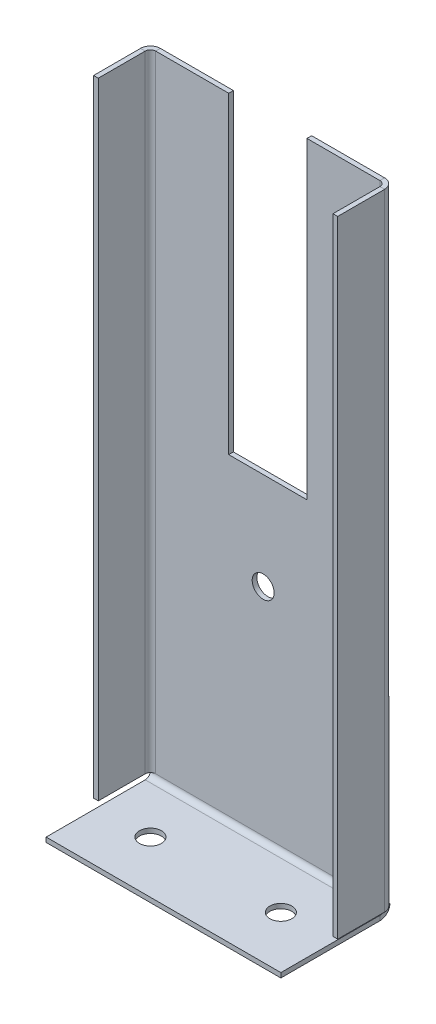
ISO-10303-21;
HEADER;
FILE_DESCRIPTION(('STEP AP214'),'2;1');
FILE_NAME('part.step','',(''),(''),'','','');
FILE_SCHEMA(('AUTOMOTIVE_DESIGN { 1 0 10303 214 1 1 1 1 }'));
ENDSEC;
DATA;
#1=APPLICATION_CONTEXT('core data for automotive mechanical design processes');
#2=APPLICATION_PROTOCOL_DEFINITION('international standard','automotive_design',2000,#1);
#3=PRODUCT_CONTEXT('',#1,'mechanical');
#4=PRODUCT('Part','Part','',(#3));
#5=PRODUCT_RELATED_PRODUCT_CATEGORY('part','',(#4));
#6=PRODUCT_DEFINITION_FORMATION('','',#4);
#7=PRODUCT_DEFINITION_CONTEXT('part definition',#1,'design');
#8=PRODUCT_DEFINITION('design','',#6,#7);
#9=PRODUCT_DEFINITION_SHAPE('','',#8);
#10=(LENGTH_UNIT() NAMED_UNIT(*) SI_UNIT(.MILLI.,.METRE.));
#11=(NAMED_UNIT(*) PLANE_ANGLE_UNIT() SI_UNIT($,.RADIAN.));
#12=(NAMED_UNIT(*) SI_UNIT($,.STERADIAN.) SOLID_ANGLE_UNIT());
#13=UNCERTAINTY_MEASURE_WITH_UNIT(LENGTH_MEASURE(1.E-05),#10,'distance_accuracy_value','');
#14=(GEOMETRIC_REPRESENTATION_CONTEXT(3) GLOBAL_UNCERTAINTY_ASSIGNED_CONTEXT((#13)) GLOBAL_UNIT_ASSIGNED_CONTEXT((#10,
#11,#12)) REPRESENTATION_CONTEXT('',''));
#15=CARTESIAN_POINT('',(0.,0.,0.));
#16=DIRECTION('',(0.,0.,1.));
#17=DIRECTION('',(1.,0.,0.));
#18=AXIS2_PLACEMENT_3D('',#15,#16,#17);
#19=CARTESIAN_POINT('',(25.6629955947136,-44.4713656387665,0.));
#20=DIRECTION('',(0.,1.,0.));
#21=DIRECTION('',(0.,0.,1.));
#22=AXIS2_PLACEMENT_3D('',#19,#20,#21);
#23=PLANE('',#22);
#24=DIRECTION('',(1.,0.,0.));
#25=VECTOR('',#24,1.);
#26=CARTESIAN_POINT('',(26.6629955947137,-44.4713656387665,-0.900000000000003));
#27=LINE('',#26,#25);
#28=CARTESIAN_POINT('',(25.6629955947136,-44.4713656387665,-0.900000000000005));
#29=VERTEX_POINT('',#28);
#30=CARTESIAN_POINT('',(26.6629955947136,-44.4713656387665,-0.900000000000004));
#31=VERTEX_POINT('',#30);
#32=EDGE_CURVE('E283',#29,#31,#27,.T.);
#33=ORIENTED_EDGE('',*,*,#32,.F.);
#34=CARTESIAN_POINT('',(25.6629955947137,-44.4713656387665,1.));
#35=DIRECTION('',(0.,1.,0.));
#36=DIRECTION('',(0.,0.,1.));
#37=AXIS2_PLACEMENT_3D('',#34,#35,#36);
#38=CIRCLE('',#37,1.9);
#39=CARTESIAN_POINT('',(26.6629955947137,-44.4713656387665,-0.615549442140356));
#40=VERTEX_POINT('',#39);
#41=EDGE_CURVE('E271',#29,#40,#38,.F.);
#42=ORIENTED_EDGE('',*,*,#41,.T.);
#43=DIRECTION('',(0.,0.,1.));
#44=VECTOR('',#43,1.);
#45=CARTESIAN_POINT('',(26.6629955947137,-44.4713656387665,-0.9));
#46=LINE('',#45,#44);
#47=EDGE_CURVE('E66',#31,#40,#46,.T.);
#48=ORIENTED_EDGE('',*,*,#47,.F.);
#49=EDGE_LOOP('',(#33,#42,#48));
#50=FACE_BOUND('',#49,.T.);
#51=ADVANCED_FACE('F57',(#50),#23,.T.);
#52=CARTESIAN_POINT('',(0.,0.,-0.9));
#53=DIRECTION('',(0.,0.,1.));
#54=DIRECTION('',(1.,0.,0.));
#55=AXIS2_PLACEMENT_3D('',#52,#53,#54);
#56=PLANE('',#55);
#57=CARTESIAN_POINT('',(3.27299701959848,-3.08576525859256,-0.900000000000008));
#58=DIRECTION('',(0.,0.,1.));
#59=DIRECTION('',(1.,0.,0.));
#60=AXIS2_PLACEMENT_3D('',#57,#58,#59);
#61=CIRCLE('',#60,2.1082);
#62=CARTESIAN_POINT('',(5.38119701959848,-3.08576525859256,-0.900000000000008));
#63=VERTEX_POINT('',#62);
#64=EDGE_CURVE('E934',#63,#63,#61,.T.);
#65=ORIENTED_EDGE('',*,*,#64,.T.);
#66=EDGE_LOOP('',(#65));
#67=FACE_BOUND('',#66,.T.);
#68=DIRECTION('',(0.,1.,0.));
#69=VECTOR('',#68,1.);
#70=CARTESIAN_POINT('',(25.6629955947136,75.5286343612335,-0.899999999999992));
#71=LINE('',#70,#69);
#72=CARTESIAN_POINT('',(25.6629955947136,75.5286343612335,-0.899999999999992));
#73=VERTEX_POINT('',#72);
#74=EDGE_CURVE('E225',#73,#29,#71,.F.);
#75=ORIENTED_EDGE('',*,*,#74,.T.);
#76=DIRECTION('',(1.,0.,0.));
#77=VECTOR('',#76,1.);
#78=CARTESIAN_POINT('',(-18.3370044052863,-44.4713656387665,-0.9));
#79=LINE('',#78,#77);
#80=CARTESIAN_POINT('',(-17.3370044052863,-44.4713656387665,-0.9));
#81=VERTEX_POINT('',#80);
#82=EDGE_CURVE('E406',#81,#29,#79,.T.);
#83=ORIENTED_EDGE('',*,*,#82,.F.);
#84=DIRECTION('',(0.,-1.,0.));
#85=VECTOR('',#84,1.);
#86=CARTESIAN_POINT('',(-17.3370044052863,-44.4713656387665,-0.899999999999995));
#87=LINE('',#86,#85);
#88=CARTESIAN_POINT('',(-17.3370044052863,75.5286343612335,-0.9));
#89=VERTEX_POINT('',#88);
#90=EDGE_CURVE('E83',#81,#89,#87,.F.);
#91=ORIENTED_EDGE('',*,*,#90,.T.);
#92=DIRECTION('',(-1.,0.,0.));
#93=VECTOR('',#92,1.);
#94=CARTESIAN_POINT('',(-18.3370044052864,75.5286343612335,-0.9));
#95=LINE('',#94,#93);
#96=CARTESIAN_POINT('',(-3.33700440528635,75.5286343612335,-0.9));
#97=VERTEX_POINT('',#96);
#98=EDGE_CURVE('E405',#97,#89,#95,.T.);
#99=ORIENTED_EDGE('',*,*,#98,.F.);
#100=DIRECTION('',(0.,-1.,0.));
#101=VECTOR('',#100,1.);
#102=CARTESIAN_POINT('',(-3.33700440528635,0.,-0.9));
#103=LINE('',#102,#101);
#104=CARTESIAN_POINT('',(-3.33700440528635,15.5286343612335,-0.9));
#105=VERTEX_POINT('',#104);
#106=EDGE_CURVE('E356',#97,#105,#103,.T.);
#107=ORIENTED_EDGE('',*,*,#106,.T.);
#108=DIRECTION('',(1.,0.,0.));
#109=VECTOR('',#108,1.);
#110=CARTESIAN_POINT('',(0.,15.5286343612335,-0.9));
#111=LINE('',#110,#109);
#112=CARTESIAN_POINT('',(11.6629955947137,15.5286343612335,-0.9));
#113=VERTEX_POINT('',#112);
#114=EDGE_CURVE('E343',#105,#113,#111,.T.);
#115=ORIENTED_EDGE('',*,*,#114,.T.);
#116=DIRECTION('',(0.,1.,0.));
#117=VECTOR('',#116,1.);
#118=CARTESIAN_POINT('',(11.6629955947137,0.,-0.9));
#119=LINE('',#118,#117);
#120=CARTESIAN_POINT('',(11.6629955947137,75.5286343612335,-0.9));
#121=VERTEX_POINT('',#120);
#122=EDGE_CURVE('E353',#113,#121,#119,.T.);
#123=ORIENTED_EDGE('',*,*,#122,.T.);
#124=EDGE_CURVE('E407',#73,#121,#95,.T.);
#125=ORIENTED_EDGE('',*,*,#124,.F.);
#126=EDGE_LOOP('',(#75,#83,#91,#99,#107,#115,#123,#125));
#127=FACE_BOUND('',#126,.T.);
#128=ADVANCED_FACE('F433',(#67,#127),#56,.F.);
#129=CARTESIAN_POINT('',(0.,0.,0.));
#130=DIRECTION('',(0.,0.,1.));
#131=DIRECTION('',(1.,0.,0.));
#132=AXIS2_PLACEMENT_3D('',#129,#130,#131);
#133=PLANE('',#132);
#134=CARTESIAN_POINT('',(3.27299701959848,-3.08576525859256,0.));
#135=DIRECTION('',(0.,0.,1.));
#136=DIRECTION('',(1.,0.,0.));
#137=AXIS2_PLACEMENT_3D('',#134,#135,#136);
#138=CIRCLE('',#137,2.1082);
#139=CARTESIAN_POINT('',(5.38119701959848,-3.08576525859256,0.));
#140=VERTEX_POINT('',#139);
#141=EDGE_CURVE('E937',#140,#140,#138,.T.);
#142=ORIENTED_EDGE('',*,*,#141,.F.);
#143=EDGE_LOOP('',(#142));
#144=FACE_BOUND('',#143,.T.);
#145=DIRECTION('',(1.,0.,0.));
#146=VECTOR('',#145,1.);
#147=CARTESIAN_POINT('',(-18.3370044052863,-44.4713656387665,0.));
#148=LINE('',#147,#146);
#149=CARTESIAN_POINT('',(-17.3370044052863,-44.4713656387665,0.));
#150=VERTEX_POINT('',#149);
#151=CARTESIAN_POINT('',(25.6629955947136,-44.4713656387665,0.));
#152=VERTEX_POINT('',#151);
#153=EDGE_CURVE('E393',#150,#152,#148,.T.);
#154=ORIENTED_EDGE('',*,*,#153,.T.);
#155=DIRECTION('',(0.,1.,0.));
#156=VECTOR('',#155,1.);
#157=CARTESIAN_POINT('',(25.6629955947136,75.5286343612335,0.));
#158=LINE('',#157,#156);
#159=CARTESIAN_POINT('',(25.6629955947136,75.5286343612335,0.));
#160=VERTEX_POINT('',#159);
#161=EDGE_CURVE('E277',#160,#152,#158,.F.);
#162=ORIENTED_EDGE('',*,*,#161,.F.);
#163=DIRECTION('',(-1.,0.,0.));
#164=VECTOR('',#163,1.);
#165=CARTESIAN_POINT('',(-18.3370044052864,75.5286343612335,0.));
#166=LINE('',#165,#164);
#167=CARTESIAN_POINT('',(11.6629955947137,75.5286343612335,0.));
#168=VERTEX_POINT('',#167);
#169=EDGE_CURVE('E413',#160,#168,#166,.T.);
#170=ORIENTED_EDGE('',*,*,#169,.T.);
#171=DIRECTION('',(0.,1.,0.));
#172=VECTOR('',#171,1.);
#173=CARTESIAN_POINT('',(11.6629955947137,75.5286343612335,0.));
#174=LINE('',#173,#172);
#175=CARTESIAN_POINT('',(11.6629955947137,15.5286343612335,0.));
#176=VERTEX_POINT('',#175);
#177=EDGE_CURVE('E337',#176,#168,#174,.T.);
#178=ORIENTED_EDGE('',*,*,#177,.F.);
#179=DIRECTION('',(1.,0.,0.));
#180=VECTOR('',#179,1.);
#181=CARTESIAN_POINT('',(-3.33700440528635,15.5286343612335,0.));
#182=LINE('',#181,#180);
#183=CARTESIAN_POINT('',(-3.33700440528635,15.5286343612335,0.));
#184=VERTEX_POINT('',#183);
#185=EDGE_CURVE('E334',#184,#176,#182,.T.);
#186=ORIENTED_EDGE('',*,*,#185,.F.);
#187=DIRECTION('',(0.,-1.,0.));
#188=VECTOR('',#187,1.);
#189=CARTESIAN_POINT('',(-3.33700440528635,75.5286343612335,0.));
#190=LINE('',#189,#188);
#191=CARTESIAN_POINT('',(-3.33700440528635,75.5286343612335,0.));
#192=VERTEX_POINT('',#191);
#193=EDGE_CURVE('E332',#192,#184,#190,.T.);
#194=ORIENTED_EDGE('',*,*,#193,.F.);
#195=CARTESIAN_POINT('',(-17.3370044052863,75.5286343612335,0.));
#196=VERTEX_POINT('',#195);
#197=EDGE_CURVE('E412',#192,#196,#166,.T.);
#198=ORIENTED_EDGE('',*,*,#197,.T.);
#199=DIRECTION('',(0.,-1.,0.));
#200=VECTOR('',#199,1.);
#201=CARTESIAN_POINT('',(-17.3370044052863,-44.4713656387665,0.));
#202=LINE('',#201,#200);
#203=EDGE_CURVE('E325',#150,#196,#202,.F.);
#204=ORIENTED_EDGE('',*,*,#203,.F.);
#205=EDGE_LOOP('',(#154,#162,#170,#178,#186,#194,#198,#204));
#206=FACE_BOUND('',#205,.T.);
#207=ADVANCED_FACE('F481',(#144,#206),#133,.T.);
#208=CARTESIAN_POINT('',(-18.3370044052864,75.5286343612335,-0.9));
#209=DIRECTION('',(0.,1.,0.));
#210=DIRECTION('',(0.,0.,1.));
#211=AXIS2_PLACEMENT_3D('',#208,#209,#210);
#212=PLANE('',#211);
#213=ORIENTED_EDGE('',*,*,#169,.F.);
#214=DIRECTION('',(0.,0.,-1.));
#215=VECTOR('',#214,1.);
#216=CARTESIAN_POINT('',(25.6629955947136,75.5286343612335,0.));
#217=LINE('',#216,#215);
#218=EDGE_CURVE('E273',#160,#73,#217,.T.);
#219=ORIENTED_EDGE('',*,*,#218,.T.);
#220=ORIENTED_EDGE('',*,*,#124,.T.);
#221=DIRECTION('',(0.,0.,1.));
#222=VECTOR('',#221,1.);
#223=CARTESIAN_POINT('',(11.6629955947137,75.5286343612335,-10.));
#224=LINE('',#223,#222);
#225=EDGE_CURVE('E344',#121,#168,#224,.T.);
#226=ORIENTED_EDGE('',*,*,#225,.T.);
#227=EDGE_LOOP('',(#213,#219,#220,#226));
#228=FACE_BOUND('',#227,.T.);
#229=ADVANCED_FACE('F59',(#228),#212,.T.);
#230=CARTESIAN_POINT('',(-18.3370044052863,-44.4713656387665,0.));
#231=DIRECTION('',(0.,1.,0.));
#232=DIRECTION('',(0.,0.,1.));
#233=AXIS2_PLACEMENT_3D('',#230,#231,#232);
#234=PLANE('',#233);
#235=DIRECTION('',(0.,0.,1.));
#236=VECTOR('',#235,1.);
#237=CARTESIAN_POINT('',(-18.3370044052863,-44.4713656387665,-0.9));
#238=LINE('',#237,#236);
#239=CARTESIAN_POINT('',(-18.3370044052863,-44.4713656387665,-0.9));
#240=VERTEX_POINT('',#239);
#241=CARTESIAN_POINT('',(-18.3370044052863,-44.4713656387665,-0.615549442140354));
#242=VERTEX_POINT('',#241);
#243=EDGE_CURVE('E61',#240,#242,#238,.T.);
#244=ORIENTED_EDGE('',*,*,#243,.T.);
#245=CARTESIAN_POINT('',(-17.3370044052864,-44.4713656387665,1.00000000000001));
#246=DIRECTION('',(0.,-1.,0.));
#247=DIRECTION('',(0.,0.,-1.));
#248=AXIS2_PLACEMENT_3D('',#245,#246,#247);
#249=CIRCLE('',#248,1.90000000000001);
#250=EDGE_CURVE('E13',#242,#81,#249,.T.);
#251=ORIENTED_EDGE('',*,*,#250,.T.);
#252=EDGE_CURVE('E402',#240,#81,#79,.T.);
#253=ORIENTED_EDGE('',*,*,#252,.F.);
#254=EDGE_LOOP('',(#244,#251,#253));
#255=FACE_BOUND('',#254,.T.);
#256=ADVANCED_FACE('F431',(#255),#234,.T.);
#257=DIRECTION('',(0.,0.,-1.));
#258=VECTOR('',#257,1.);
#259=CARTESIAN_POINT('',(-17.3370044052863,75.5286343612335,0.));
#260=LINE('',#259,#258);
#261=EDGE_CURVE('E319',#196,#89,#260,.T.);
#262=ORIENTED_EDGE('',*,*,#261,.F.);
#263=ORIENTED_EDGE('',*,*,#197,.F.);
#264=DIRECTION('',(0.,0.,1.));
#265=VECTOR('',#264,1.);
#266=CARTESIAN_POINT('',(-3.33700440528635,75.5286343612335,-10.));
#267=LINE('',#266,#265);
#268=EDGE_CURVE('E341',#97,#192,#267,.T.);
#269=ORIENTED_EDGE('',*,*,#268,.F.);
#270=ORIENTED_EDGE('',*,*,#98,.T.);
#271=EDGE_LOOP('',(#262,#263,#269,#270));
#272=FACE_BOUND('',#271,.T.);
#273=ADVANCED_FACE('F523',(#272),#212,.T.);
#274=CARTESIAN_POINT('',(-18.3370044052863,-44.4713656387665,0.999999999999997));
#275=DIRECTION('',(-1.,0.,0.));
#276=DIRECTION('',(0.,0.,1.));
#277=AXIS2_PLACEMENT_3D('',#274,#275,#276);
#278=PLANE('',#277);
#279=DIRECTION('',(0.,1.,0.));
#280=VECTOR('',#279,1.);
#281=CARTESIAN_POINT('',(-18.3370044052863,-46.3713656387665,0.999999999999991));
#282=LINE('',#281,#280);
#283=CARTESIAN_POINT('',(-18.3370044052863,-45.4713656387665,0.999999999999994));
#284=VERTEX_POINT('',#283);
#285=CARTESIAN_POINT('',(-18.3370044052863,-46.3713656387665,0.999999999999991));
#286=VERTEX_POINT('',#285);
#287=EDGE_CURVE('E359',#284,#286,#282,.F.);
#288=ORIENTED_EDGE('',*,*,#287,.F.);
#289=CARTESIAN_POINT('',(-18.3370044052863,-44.4713656387665,0.999999999999997));
#290=DIRECTION('',(1.,0.,0.));
#291=DIRECTION('',(0.,0.,-1.));
#292=AXIS2_PLACEMENT_3D('',#289,#290,#291);
#293=CIRCLE('',#292,1.);
#294=CARTESIAN_POINT('',(-18.3370044052863,-44.4713656387665,0.));
#295=VERTEX_POINT('',#294);
#296=EDGE_CURVE('E397',#295,#284,#293,.F.);
#297=ORIENTED_EDGE('',*,*,#296,.F.);
#298=EDGE_CURVE('E75',#242,#295,#238,.T.);
#299=ORIENTED_EDGE('',*,*,#298,.F.);
#300=ORIENTED_EDGE('',*,*,#243,.F.);
#301=CARTESIAN_POINT('',(-18.3370044052863,-44.4713656387665,0.999999999999997));
#302=DIRECTION('',(1.,0.,0.));
#303=DIRECTION('',(0.,0.,-1.));
#304=AXIS2_PLACEMENT_3D('',#301,#302,#303);
#305=CIRCLE('',#304,1.9);
#306=EDGE_CURVE('E390',#240,#286,#305,.F.);
#307=ORIENTED_EDGE('',*,*,#306,.T.);
#308=EDGE_LOOP('',(#288,#297,#299,#300,#307));
#309=FACE_BOUND('',#308,.T.);
#310=ADVANCED_FACE('F440',(#309),#278,.T.);
#311=CARTESIAN_POINT('',(26.6629955947136,-44.4713656387665,0.999999999999997));
#312=DIRECTION('',(-1.,0.,0.));
#313=DIRECTION('',(0.,0.,1.));
#314=AXIS2_PLACEMENT_3D('',#311,#312,#313);
#315=PLANE('',#314);
#316=CARTESIAN_POINT('',(26.6629955947136,-44.4713656387665,0.999999999999997));
#317=DIRECTION('',(1.,0.,0.));
#318=DIRECTION('',(0.,0.,-1.));
#319=AXIS2_PLACEMENT_3D('',#316,#317,#318);
#320=CIRCLE('',#319,1.);
#321=CARTESIAN_POINT('',(26.6629955947136,-45.4713656387665,0.999999999999994));
#322=VERTEX_POINT('',#321);
#323=CARTESIAN_POINT('',(26.6629955947137,-44.4713656387665,0.));
#324=VERTEX_POINT('',#323);
#325=EDGE_CURVE('E363',#322,#324,#320,.T.);
#326=ORIENTED_EDGE('',*,*,#325,.F.);
#327=DIRECTION('',(0.,1.,0.));
#328=VECTOR('',#327,1.);
#329=CARTESIAN_POINT('',(26.6629955947137,-45.4713656387665,0.999999999999994));
#330=LINE('',#329,#328);
#331=CARTESIAN_POINT('',(26.6629955947136,-46.3713656387665,0.999999999999991));
#332=VERTEX_POINT('',#331);
#333=EDGE_CURVE('E383',#322,#332,#330,.F.);
#334=ORIENTED_EDGE('',*,*,#333,.T.);
#335=CARTESIAN_POINT('',(26.6629955947136,-44.4713656387665,0.999999999999997));
#336=DIRECTION('',(1.,0.,0.));
#337=DIRECTION('',(0.,0.,-1.));
#338=AXIS2_PLACEMENT_3D('',#335,#336,#337);
#339=CIRCLE('',#338,1.9);
#340=EDGE_CURVE('E394',#332,#31,#339,.T.);
#341=ORIENTED_EDGE('',*,*,#340,.T.);
#342=ORIENTED_EDGE('',*,*,#47,.T.);
#343=EDGE_CURVE('E415',#40,#324,#46,.T.);
#344=ORIENTED_EDGE('',*,*,#343,.T.);
#345=EDGE_LOOP('',(#326,#334,#341,#342,#344));
#346=FACE_BOUND('',#345,.T.);
#347=ADVANCED_FACE('F462',(#346),#315,.F.);
#348=CARTESIAN_POINT('',(26.6629955947137,-44.4713656387665,0.999999999999997));
#349=DIRECTION('',(1.,0.,0.));
#350=DIRECTION('',(0.,-1.,0.));
#351=AXIS2_PLACEMENT_3D('',#348,#349,#350);
#352=CYLINDRICAL_SURFACE('',#351,1.9);
#353=ORIENTED_EDGE('',*,*,#252,.T.);
#354=ORIENTED_EDGE('',*,*,#82,.T.);
#355=ORIENTED_EDGE('',*,*,#32,.T.);
#356=ORIENTED_EDGE('',*,*,#340,.F.);
#357=DIRECTION('',(1.,0.,0.));
#358=VECTOR('',#357,1.);
#359=CARTESIAN_POINT('',(-18.3370044052863,-46.3713656387665,0.999999999999991));
#360=LINE('',#359,#358);
#361=EDGE_CURVE('E381',#332,#286,#360,.F.);
#362=ORIENTED_EDGE('',*,*,#361,.T.);
#363=ORIENTED_EDGE('',*,*,#306,.F.);
#364=EDGE_LOOP('',(#353,#354,#355,#356,#362,#363));
#365=FACE_BOUND('',#364,.T.);
#366=ADVANCED_FACE('F438',(#365),#352,.T.);
#367=CARTESIAN_POINT('',(26.6629955947137,-44.4713656387665,0.999999999999997));
#368=DIRECTION('',(1.,0.,0.));
#369=DIRECTION('',(0.,-1.,0.));
#370=AXIS2_PLACEMENT_3D('',#367,#368,#369);
#371=CYLINDRICAL_SURFACE('',#370,1.);
#372=EDGE_CURVE('E409',#295,#150,#148,.T.);
#373=ORIENTED_EDGE('',*,*,#372,.F.);
#374=ORIENTED_EDGE('',*,*,#296,.T.);
#375=DIRECTION('',(1.,0.,0.));
#376=VECTOR('',#375,1.);
#377=CARTESIAN_POINT('',(-18.3370044052863,-45.4713656387665,0.999999999999994));
#378=LINE('',#377,#376);
#379=EDGE_CURVE('E386',#284,#322,#378,.T.);
#380=ORIENTED_EDGE('',*,*,#379,.T.);
#381=ORIENTED_EDGE('',*,*,#325,.T.);
#382=DIRECTION('',(1.,0.,0.));
#383=VECTOR('',#382,1.);
#384=CARTESIAN_POINT('',(25.6629955947136,-44.4713656387665,0.));
#385=LINE('',#384,#383);
#386=EDGE_CURVE('E281',#152,#324,#385,.T.);
#387=ORIENTED_EDGE('',*,*,#386,.F.);
#388=ORIENTED_EDGE('',*,*,#153,.F.);
#389=EDGE_LOOP('',(#373,#374,#380,#381,#387,#388));
#390=FACE_BOUND('',#389,.T.);
#391=ADVANCED_FACE('F459',(#390),#371,.F.);
#392=CARTESIAN_POINT('',(-18.3370044052863,-46.3713656387665,0.));
#393=DIRECTION('',(1.,0.,0.));
#394=DIRECTION('',(0.,0.,-1.));
#395=AXIS2_PLACEMENT_3D('',#392,#393,#394);
#396=PLANE('',#395);
#397=ORIENTED_EDGE('',*,*,#287,.T.);
#398=DIRECTION('',(0.,0.,-1.));
#399=VECTOR('',#398,1.);
#400=CARTESIAN_POINT('',(-18.3370044052863,-46.3713656387665,-1.57433377169592E-13));
#401=LINE('',#400,#399);
#402=CARTESIAN_POINT('',(-18.3370044052863,-46.3713656387666,20.));
#403=VERTEX_POINT('',#402);
#404=EDGE_CURVE('E371',#403,#286,#401,.T.);
#405=ORIENTED_EDGE('',*,*,#404,.F.);
#406=DIRECTION('',(0.,1.,0.));
#407=VECTOR('',#406,1.);
#408=CARTESIAN_POINT('',(-18.3370044052863,-46.3713656387666,20.));
#409=LINE('',#408,#407);
#410=CARTESIAN_POINT('',(-18.3370044052863,-45.4713656387666,20.));
#411=VERTEX_POINT('',#410);
#412=EDGE_CURVE('E364',#403,#411,#409,.T.);
#413=ORIENTED_EDGE('',*,*,#412,.T.);
#414=DIRECTION('',(0.,0.,1.));
#415=VECTOR('',#414,1.);
#416=CARTESIAN_POINT('',(-18.3370044052863,-45.4713656387665,0.));
#417=LINE('',#416,#415);
#418=EDGE_CURVE('E378',#411,#284,#417,.F.);
#419=ORIENTED_EDGE('',*,*,#418,.T.);
#420=EDGE_LOOP('',(#397,#405,#413,#419));
#421=FACE_BOUND('',#420,.T.);
#422=ADVANCED_FACE('F443',(#421),#396,.F.);
#423=CARTESIAN_POINT('',(26.6629955947136,-46.3713656387666,20.));
#424=DIRECTION('',(-1.,0.,0.));
#425=DIRECTION('',(0.,0.,1.));
#426=AXIS2_PLACEMENT_3D('',#423,#424,#425);
#427=PLANE('',#426);
#428=ORIENTED_EDGE('',*,*,#333,.F.);
#429=DIRECTION('',(0.,0.,-1.));
#430=VECTOR('',#429,1.);
#431=CARTESIAN_POINT('',(26.6629955947136,-45.4713656387666,20.));
#432=LINE('',#431,#430);
#433=CARTESIAN_POINT('',(26.6629955947136,-45.4713656387666,20.));
#434=VERTEX_POINT('',#433);
#435=EDGE_CURVE('E376',#322,#434,#432,.F.);
#436=ORIENTED_EDGE('',*,*,#435,.T.);
#437=DIRECTION('',(0.,1.,0.));
#438=VECTOR('',#437,1.);
#439=CARTESIAN_POINT('',(26.6629955947137,-46.3713656387666,20.));
#440=LINE('',#439,#438);
#441=CARTESIAN_POINT('',(26.6629955947136,-46.3713656387666,20.));
#442=VERTEX_POINT('',#441);
#443=EDGE_CURVE('E360',#442,#434,#440,.T.);
#444=ORIENTED_EDGE('',*,*,#443,.F.);
#445=DIRECTION('',(0.,0.,1.));
#446=VECTOR('',#445,1.);
#447=CARTESIAN_POINT('',(26.6629955947136,-46.3713656387665,-1.57433377169592E-13));
#448=LINE('',#447,#446);
#449=EDGE_CURVE('E369',#332,#442,#448,.T.);
#450=ORIENTED_EDGE('',*,*,#449,.F.);
#451=EDGE_LOOP('',(#428,#436,#444,#450));
#452=FACE_BOUND('',#451,.T.);
#453=ADVANCED_FACE('F464',(#452),#427,.F.);
#454=CARTESIAN_POINT('',(0.,-46.3713656387665,-1.57433377169592E-13));
#455=DIRECTION('',(0.,1.,0.));
#456=DIRECTION('',(0.,0.,1.));
#457=AXIS2_PLACEMENT_3D('',#454,#455,#456);
#458=PLANE('',#457);
#459=CARTESIAN_POINT('',(16.6629955947136,-46.3713656387666,10.));
#460=DIRECTION('',(0.,1.,0.));
#461=DIRECTION('',(0.,0.,1.));
#462=AXIS2_PLACEMENT_3D('',#459,#460,#461);
#463=CIRCLE('',#462,2.1082);
#464=CARTESIAN_POINT('',(16.6629955947136,-46.3713656387666,12.1082));
#465=VERTEX_POINT('',#464);
#466=EDGE_CURVE('E928',#465,#465,#463,.T.);
#467=ORIENTED_EDGE('',*,*,#466,.T.);
#468=EDGE_LOOP('',(#467));
#469=FACE_BOUND('',#468,.T.);
#470=CARTESIAN_POINT('',(-8.33700440528633,-46.3713656387666,10.));
#471=DIRECTION('',(0.,1.,0.));
#472=DIRECTION('',(0.,0.,1.));
#473=AXIS2_PLACEMENT_3D('',#470,#471,#472);
#474=CIRCLE('',#473,2.1082);
#475=CARTESIAN_POINT('',(-8.33700440528633,-46.3713656387666,12.1082));
#476=VERTEX_POINT('',#475);
#477=EDGE_CURVE('E920',#476,#476,#474,.T.);
#478=ORIENTED_EDGE('',*,*,#477,.T.);
#479=EDGE_LOOP('',(#478));
#480=FACE_BOUND('',#479,.T.);
#481=ORIENTED_EDGE('',*,*,#361,.F.);
#482=ORIENTED_EDGE('',*,*,#449,.T.);
#483=DIRECTION('',(-1.,0.,0.));
#484=VECTOR('',#483,1.);
#485=CARTESIAN_POINT('',(0.,-46.3713656387666,20.));
#486=LINE('',#485,#484);
#487=EDGE_CURVE('E367',#442,#403,#486,.T.);
#488=ORIENTED_EDGE('',*,*,#487,.T.);
#489=ORIENTED_EDGE('',*,*,#404,.T.);
#490=EDGE_LOOP('',(#481,#482,#488,#489));
#491=FACE_BOUND('',#490,.T.);
#492=ADVANCED_FACE('F446',(#469,#480,#491),#458,.F.);
#493=CARTESIAN_POINT('',(0.,-45.4713656387665,-1.54291043964633E-13));
#494=DIRECTION('',(0.,1.,0.));
#495=DIRECTION('',(0.,0.,1.));
#496=AXIS2_PLACEMENT_3D('',#493,#494,#495);
#497=PLANE('',#496);
#498=CARTESIAN_POINT('',(16.6629955947136,-45.4713656387665,10.));
#499=DIRECTION('',(0.,1.,0.));
#500=DIRECTION('',(0.,0.,1.));
#501=AXIS2_PLACEMENT_3D('',#498,#499,#500);
#502=CIRCLE('',#501,2.1082);
#503=CARTESIAN_POINT('',(16.6629955947136,-45.4713656387665,12.1082));
#504=VERTEX_POINT('',#503);
#505=EDGE_CURVE('E931',#504,#504,#502,.T.);
#506=ORIENTED_EDGE('',*,*,#505,.F.);
#507=EDGE_LOOP('',(#506));
#508=FACE_BOUND('',#507,.T.);
#509=CARTESIAN_POINT('',(-8.33700440528633,-45.4713656387665,10.));
#510=DIRECTION('',(0.,1.,0.));
#511=DIRECTION('',(0.,0.,1.));
#512=AXIS2_PLACEMENT_3D('',#509,#510,#511);
#513=CIRCLE('',#512,2.1082);
#514=CARTESIAN_POINT('',(-8.33700440528633,-45.4713656387665,12.1082));
#515=VERTEX_POINT('',#514);
#516=EDGE_CURVE('E923',#515,#515,#513,.T.);
#517=ORIENTED_EDGE('',*,*,#516,.F.);
#518=EDGE_LOOP('',(#517));
#519=FACE_BOUND('',#518,.T.);
#520=ORIENTED_EDGE('',*,*,#435,.F.);
#521=ORIENTED_EDGE('',*,*,#379,.F.);
#522=ORIENTED_EDGE('',*,*,#418,.F.);
#523=DIRECTION('',(1.,0.,0.));
#524=VECTOR('',#523,1.);
#525=CARTESIAN_POINT('',(-18.3370044052863,-45.4713656387666,20.));
#526=LINE('',#525,#524);
#527=EDGE_CURVE('E374',#434,#411,#526,.F.);
#528=ORIENTED_EDGE('',*,*,#527,.F.);
#529=EDGE_LOOP('',(#520,#521,#522,#528));
#530=FACE_BOUND('',#529,.T.);
#531=ADVANCED_FACE('F457',(#508,#519,#530),#497,.T.);
#532=CARTESIAN_POINT('',(-18.3370044052863,-46.3713656387666,20.));
#533=DIRECTION('',(0.,0.,-1.));
#534=DIRECTION('',(0.,1.,0.));
#535=AXIS2_PLACEMENT_3D('',#532,#533,#534);
#536=PLANE('',#535);
#537=ORIENTED_EDGE('',*,*,#527,.T.);
#538=ORIENTED_EDGE('',*,*,#412,.F.);
#539=ORIENTED_EDGE('',*,*,#487,.F.);
#540=ORIENTED_EDGE('',*,*,#443,.T.);
#541=EDGE_LOOP('',(#537,#538,#539,#540));
#542=FACE_BOUND('',#541,.T.);
#543=ADVANCED_FACE('F452',(#542),#536,.F.);
#544=CARTESIAN_POINT('',(-3.33700440528635,75.5286343612335,-10.));
#545=DIRECTION('',(-1.,0.,0.));
#546=DIRECTION('',(0.,-1.,0.));
#547=AXIS2_PLACEMENT_3D('',#544,#545,#546);
#548=PLANE('',#547);
#549=ORIENTED_EDGE('',*,*,#268,.T.);
#550=ORIENTED_EDGE('',*,*,#193,.T.);
#551=DIRECTION('',(0.,0.,1.));
#552=VECTOR('',#551,1.);
#553=CARTESIAN_POINT('',(-3.33700440528635,15.5286343612335,-10.));
#554=LINE('',#553,#552);
#555=EDGE_CURVE('E340',#105,#184,#554,.T.);
#556=ORIENTED_EDGE('',*,*,#555,.F.);
#557=ORIENTED_EDGE('',*,*,#106,.F.);
#558=EDGE_LOOP('',(#549,#550,#556,#557));
#559=FACE_BOUND('',#558,.T.);
#560=ADVANCED_FACE('F527',(#559),#548,.F.);
#561=CARTESIAN_POINT('',(11.6629955947137,75.5286343612335,-10.));
#562=DIRECTION('',(1.,0.,0.));
#563=DIRECTION('',(0.,1.,0.));
#564=AXIS2_PLACEMENT_3D('',#561,#562,#563);
#565=PLANE('',#564);
#566=DIRECTION('',(0.,0.,1.));
#567=VECTOR('',#566,1.);
#568=CARTESIAN_POINT('',(11.6629955947137,15.5286343612335,-10.));
#569=LINE('',#568,#567);
#570=EDGE_CURVE('E347',#113,#176,#569,.T.);
#571=ORIENTED_EDGE('',*,*,#570,.T.);
#572=ORIENTED_EDGE('',*,*,#177,.T.);
#573=ORIENTED_EDGE('',*,*,#225,.F.);
#574=ORIENTED_EDGE('',*,*,#122,.F.);
#575=EDGE_LOOP('',(#571,#572,#573,#574));
#576=FACE_BOUND('',#575,.T.);
#577=ADVANCED_FACE('F524',(#576),#565,.F.);
#578=CARTESIAN_POINT('',(-3.33700440528635,15.5286343612335,-10.));
#579=DIRECTION('',(0.,-1.,0.));
#580=DIRECTION('',(0.,0.,-1.));
#581=AXIS2_PLACEMENT_3D('',#578,#579,#580);
#582=PLANE('',#581);
#583=ORIENTED_EDGE('',*,*,#555,.T.);
#584=ORIENTED_EDGE('',*,*,#185,.T.);
#585=ORIENTED_EDGE('',*,*,#570,.F.);
#586=ORIENTED_EDGE('',*,*,#114,.F.);
#587=EDGE_LOOP('',(#583,#584,#585,#586));
#588=FACE_BOUND('',#587,.T.);
#589=ADVANCED_FACE('F517',(#588),#582,.F.);
#590=CARTESIAN_POINT('',(-17.3370044052864,75.5286343612335,1.));
#591=DIRECTION('',(0.,1.,0.));
#592=DIRECTION('',(0.,0.,1.));
#593=AXIS2_PLACEMENT_3D('',#590,#591,#592);
#594=PLANE('',#593);
#595=DIRECTION('',(-1.,0.,0.));
#596=VECTOR('',#595,1.);
#597=CARTESIAN_POINT('',(-18.3370044052864,75.5286343612335,0.999999999999997));
#598=LINE('',#597,#596);
#599=CARTESIAN_POINT('',(-18.3370044052864,75.5286343612335,0.999999999999996));
#600=VERTEX_POINT('',#599);
#601=CARTESIAN_POINT('',(-19.2370044052864,75.5286343612335,0.999999999999993));
#602=VERTEX_POINT('',#601);
#603=EDGE_CURVE('E285',#600,#602,#598,.T.);
#604=ORIENTED_EDGE('',*,*,#603,.F.);
#605=CARTESIAN_POINT('',(-17.3370044052864,75.5286343612335,1.));
#606=DIRECTION('',(0.,-1.,0.));
#607=DIRECTION('',(0.,0.,-1.));
#608=AXIS2_PLACEMENT_3D('',#605,#606,#607);
#609=CIRCLE('',#608,1.00000000000001);
#610=EDGE_CURVE('E322',#196,#600,#609,.F.);
#611=ORIENTED_EDGE('',*,*,#610,.F.);
#612=ORIENTED_EDGE('',*,*,#261,.T.);
#613=CARTESIAN_POINT('',(-17.3370044052864,75.5286343612335,1.));
#614=DIRECTION('',(0.,-1.,0.));
#615=DIRECTION('',(0.,0.,-1.));
#616=AXIS2_PLACEMENT_3D('',#613,#614,#615);
#617=CIRCLE('',#616,1.90000000000001);
#618=EDGE_CURVE('E317',#89,#602,#617,.F.);
#619=ORIENTED_EDGE('',*,*,#618,.T.);
#620=EDGE_LOOP('',(#604,#611,#612,#619));
#621=FACE_BOUND('',#620,.T.);
#622=ADVANCED_FACE('F514',(#621),#594,.T.);
#623=CARTESIAN_POINT('',(-17.3370044052864,-44.4713656387665,1.00000000000001));
#624=DIRECTION('',(0.,1.,0.));
#625=DIRECTION('',(0.,0.,1.));
#626=AXIS2_PLACEMENT_3D('',#623,#624,#625);
#627=PLANE('',#626);
#628=CARTESIAN_POINT('',(-19.2370044052864,-44.4713656387665,1.));
#629=VERTEX_POINT('',#628);
#630=EDGE_CURVE('E68',#629,#242,#249,.T.);
#631=ORIENTED_EDGE('',*,*,#630,.T.);
#632=ORIENTED_EDGE('',*,*,#298,.T.);
#633=ORIENTED_EDGE('',*,*,#372,.T.);
#634=CARTESIAN_POINT('',(-17.3370044052864,-44.4713656387665,1.00000000000001));
#635=DIRECTION('',(0.,-1.,0.));
#636=DIRECTION('',(0.,0.,-1.));
#637=AXIS2_PLACEMENT_3D('',#634,#635,#636);
#638=CIRCLE('',#637,1.00000000000001);
#639=CARTESIAN_POINT('',(-18.3370044052864,-44.4713656387665,1.00000000000001));
#640=VERTEX_POINT('',#639);
#641=EDGE_CURVE('E315',#640,#150,#638,.T.);
#642=ORIENTED_EDGE('',*,*,#641,.F.);
#643=DIRECTION('',(-1.,0.,0.));
#644=VECTOR('',#643,1.);
#645=CARTESIAN_POINT('',(-18.3370044052863,-44.4713656387665,1.00000000000001));
#646=LINE('',#645,#644);
#647=EDGE_CURVE('E288',#640,#629,#646,.T.);
#648=ORIENTED_EDGE('',*,*,#647,.T.);
#649=EDGE_LOOP('',(#631,#632,#633,#642,#648));
#650=FACE_BOUND('',#649,.T.);
#651=ADVANCED_FACE('F424',(#650),#627,.F.);
#652=CARTESIAN_POINT('',(-17.3370044052864,-44.4713656387665,1.00000000000001));
#653=DIRECTION('',(0.,-1.,0.));
#654=DIRECTION('',(-1.,0.,0.));
#655=AXIS2_PLACEMENT_3D('',#652,#653,#654);
#656=CYLINDRICAL_SURFACE('',#655,1.90000000000001);
#657=ORIENTED_EDGE('',*,*,#90,.F.);
#658=ORIENTED_EDGE('',*,*,#250,.F.);
#659=ORIENTED_EDGE('',*,*,#630,.F.);
#660=DIRECTION('',(0.,1.,0.));
#661=VECTOR('',#660,1.);
#662=CARTESIAN_POINT('',(-19.2370044052863,0.,1.));
#663=LINE('',#662,#661);
#664=EDGE_CURVE('E291',#629,#602,#663,.T.);
#665=ORIENTED_EDGE('',*,*,#664,.T.);
#666=ORIENTED_EDGE('',*,*,#618,.F.);
#667=EDGE_LOOP('',(#657,#658,#659,#665,#666));
#668=FACE_BOUND('',#667,.T.);
#669=ADVANCED_FACE('F429',(#668),#656,.T.);
#670=CARTESIAN_POINT('',(-17.3370044052864,-44.4713656387665,1.00000000000001));
#671=DIRECTION('',(0.,-1.,0.));
#672=DIRECTION('',(-1.,0.,0.));
#673=AXIS2_PLACEMENT_3D('',#670,#671,#672);
#674=CYLINDRICAL_SURFACE('',#673,1.00000000000001);
#675=ORIENTED_EDGE('',*,*,#203,.T.);
#676=ORIENTED_EDGE('',*,*,#610,.T.);
#677=DIRECTION('',(0.,-1.,0.));
#678=VECTOR('',#677,1.);
#679=CARTESIAN_POINT('',(-18.3370044052864,75.5286343612335,0.999999999999997));
#680=LINE('',#679,#678);
#681=EDGE_CURVE('E286',#600,#640,#680,.T.);
#682=ORIENTED_EDGE('',*,*,#681,.T.);
#683=ORIENTED_EDGE('',*,*,#641,.T.);
#684=EDGE_LOOP('',(#675,#676,#682,#683));
#685=FACE_BOUND('',#684,.T.);
#686=ADVANCED_FACE('F507',(#685),#674,.F.);
#687=CARTESIAN_POINT('',(-19.2370044052864,-44.4713656387665,10.));
#688=DIRECTION('',(0.,1.,0.));
#689=DIRECTION('',(-1.,0.,0.));
#690=AXIS2_PLACEMENT_3D('',#687,#688,#689);
#691=PLANE('',#690);
#692=ORIENTED_EDGE('',*,*,#647,.F.);
#693=DIRECTION('',(0.,0.,1.));
#694=VECTOR('',#693,1.);
#695=CARTESIAN_POINT('',(-18.3370044052864,-44.4713656387665,10.));
#696=LINE('',#695,#694);
#697=CARTESIAN_POINT('',(-18.3370044052864,-44.4713656387665,10.));
#698=VERTEX_POINT('',#697);
#699=EDGE_CURVE('E295',#640,#698,#696,.T.);
#700=ORIENTED_EDGE('',*,*,#699,.T.);
#701=DIRECTION('',(1.,0.,0.));
#702=VECTOR('',#701,1.);
#703=CARTESIAN_POINT('',(-19.2370044052864,-44.4713656387665,10.));
#704=LINE('',#703,#702);
#705=CARTESIAN_POINT('',(-19.2370044052864,-44.4713656387665,10.));
#706=VERTEX_POINT('',#705);
#707=EDGE_CURVE('E312',#706,#698,#704,.T.);
#708=ORIENTED_EDGE('',*,*,#707,.F.);
#709=DIRECTION('',(0.,0.,1.));
#710=VECTOR('',#709,1.);
#711=CARTESIAN_POINT('',(-19.2370044052864,-44.4713656387665,10.));
#712=LINE('',#711,#710);
#713=EDGE_CURVE('E296',#629,#706,#712,.T.);
#714=ORIENTED_EDGE('',*,*,#713,.F.);
#715=EDGE_LOOP('',(#692,#700,#708,#714));
#716=FACE_BOUND('',#715,.T.);
#717=ADVANCED_FACE('F499',(#716),#691,.F.);
#718=CARTESIAN_POINT('',(-19.2370044052864,75.5286343612335,0.));
#719=DIRECTION('',(0.,-1.,0.));
#720=DIRECTION('',(1.,0.,0.));
#721=AXIS2_PLACEMENT_3D('',#718,#719,#720);
#722=PLANE('',#721);
#723=ORIENTED_EDGE('',*,*,#603,.T.);
#724=DIRECTION('',(0.,0.,-1.));
#725=VECTOR('',#724,1.);
#726=CARTESIAN_POINT('',(-19.2370044052864,75.5286343612335,0.));
#727=LINE('',#726,#725);
#728=CARTESIAN_POINT('',(-19.2370044052864,75.5286343612335,10.));
#729=VERTEX_POINT('',#728);
#730=EDGE_CURVE('E301',#729,#602,#727,.T.);
#731=ORIENTED_EDGE('',*,*,#730,.F.);
#732=DIRECTION('',(1.,0.,0.));
#733=VECTOR('',#732,1.);
#734=CARTESIAN_POINT('',(-19.2370044052864,75.5286343612335,10.));
#735=LINE('',#734,#733);
#736=CARTESIAN_POINT('',(-18.3370044052864,75.5286343612335,10.));
#737=VERTEX_POINT('',#736);
#738=EDGE_CURVE('E304',#729,#737,#735,.T.);
#739=ORIENTED_EDGE('',*,*,#738,.T.);
#740=DIRECTION('',(0.,0.,-1.));
#741=VECTOR('',#740,1.);
#742=CARTESIAN_POINT('',(-18.3370044052864,75.5286343612335,0.));
#743=LINE('',#742,#741);
#744=EDGE_CURVE('E299',#737,#600,#743,.T.);
#745=ORIENTED_EDGE('',*,*,#744,.T.);
#746=EDGE_LOOP('',(#723,#731,#739,#745));
#747=FACE_BOUND('',#746,.T.);
#748=ADVANCED_FACE('F491',(#747),#722,.F.);
#749=CARTESIAN_POINT('',(-19.2370044052863,0.,0.));
#750=DIRECTION('',(1.,0.,0.));
#751=DIRECTION('',(0.,0.,-1.));
#752=AXIS2_PLACEMENT_3D('',#749,#750,#751);
#753=PLANE('',#752);
#754=ORIENTED_EDGE('',*,*,#664,.F.);
#755=ORIENTED_EDGE('',*,*,#713,.T.);
#756=DIRECTION('',(0.,1.,0.));
#757=VECTOR('',#756,1.);
#758=CARTESIAN_POINT('',(-19.2370044052864,75.5286343612335,10.));
#759=LINE('',#758,#757);
#760=EDGE_CURVE('E298',#706,#729,#759,.T.);
#761=ORIENTED_EDGE('',*,*,#760,.T.);
#762=ORIENTED_EDGE('',*,*,#730,.T.);
#763=EDGE_LOOP('',(#754,#755,#761,#762));
#764=FACE_BOUND('',#763,.T.);
#765=ADVANCED_FACE('F487',(#764),#753,.F.);
#766=CARTESIAN_POINT('',(-18.3370044052863,0.,0.));
#767=DIRECTION('',(1.,0.,0.));
#768=DIRECTION('',(0.,0.,-1.));
#769=AXIS2_PLACEMENT_3D('',#766,#767,#768);
#770=PLANE('',#769);
#771=ORIENTED_EDGE('',*,*,#699,.F.);
#772=ORIENTED_EDGE('',*,*,#681,.F.);
#773=ORIENTED_EDGE('',*,*,#744,.F.);
#774=DIRECTION('',(0.,1.,0.));
#775=VECTOR('',#774,1.);
#776=CARTESIAN_POINT('',(-18.3370044052864,75.5286343612335,10.));
#777=LINE('',#776,#775);
#778=EDGE_CURVE('E306',#698,#737,#777,.T.);
#779=ORIENTED_EDGE('',*,*,#778,.F.);
#780=EDGE_LOOP('',(#771,#772,#773,#779));
#781=FACE_BOUND('',#780,.T.);
#782=ADVANCED_FACE('F490',(#781),#770,.T.);
#783=CARTESIAN_POINT('',(-19.2370044052864,75.5286343612335,10.));
#784=DIRECTION('',(0.,0.,-1.));
#785=DIRECTION('',(-1.,0.,0.));
#786=AXIS2_PLACEMENT_3D('',#783,#784,#785);
#787=PLANE('',#786);
#788=ORIENTED_EDGE('',*,*,#778,.T.);
#789=ORIENTED_EDGE('',*,*,#738,.F.);
#790=ORIENTED_EDGE('',*,*,#760,.F.);
#791=ORIENTED_EDGE('',*,*,#707,.T.);
#792=EDGE_LOOP('',(#788,#789,#790,#791));
#793=FACE_BOUND('',#792,.T.);
#794=ADVANCED_FACE('F495',(#793),#787,.F.);
#795=CARTESIAN_POINT('',(25.6629955947137,-44.4713656387665,1.));
#796=DIRECTION('',(0.,-1.,0.));
#797=DIRECTION('',(0.,0.,-1.));
#798=AXIS2_PLACEMENT_3D('',#795,#796,#797);
#799=PLANE('',#798);
#800=CARTESIAN_POINT('',(25.6629955947137,-44.4713656387665,1.));
#801=DIRECTION('',(0.,1.,0.));
#802=DIRECTION('',(0.,0.,1.));
#803=AXIS2_PLACEMENT_3D('',#800,#801,#802);
#804=CIRCLE('',#803,1.);
#805=CARTESIAN_POINT('',(26.6629955947137,-44.4713656387665,0.999999999999996));
#806=VERTEX_POINT('',#805);
#807=EDGE_CURVE('E228',#152,#806,#804,.F.);
#808=ORIENTED_EDGE('',*,*,#807,.F.);
#809=ORIENTED_EDGE('',*,*,#386,.T.);
#810=ORIENTED_EDGE('',*,*,#343,.F.);
#811=CARTESIAN_POINT('',(27.5629955947137,-44.4713656387665,0.999999999999993));
#812=VERTEX_POINT('',#811);
#813=EDGE_CURVE('E270',#40,#812,#38,.F.);
#814=ORIENTED_EDGE('',*,*,#813,.T.);
#815=DIRECTION('',(1.,0.,0.));
#816=VECTOR('',#815,1.);
#817=CARTESIAN_POINT('',(26.6629955947137,-44.4713656387665,0.999999999999997));
#818=LINE('',#817,#816);
#819=EDGE_CURVE('E915',#806,#812,#818,.T.);
#820=ORIENTED_EDGE('',*,*,#819,.F.);
#821=EDGE_LOOP('',(#808,#809,#810,#814,#820));
#822=FACE_BOUND('',#821,.T.);
#823=ADVANCED_FACE('F503',(#822),#799,.T.);
#824=CARTESIAN_POINT('',(25.6629955947137,75.5286343612335,1.00000000000001));
#825=DIRECTION('',(0.,-1.,0.));
#826=DIRECTION('',(0.,0.,-1.));
#827=AXIS2_PLACEMENT_3D('',#824,#825,#826);
#828=PLANE('',#827);
#829=CARTESIAN_POINT('',(25.6629955947137,75.5286343612335,1.00000000000001));
#830=DIRECTION('',(0.,1.,0.));
#831=DIRECTION('',(0.,0.,1.));
#832=AXIS2_PLACEMENT_3D('',#829,#830,#831);
#833=CIRCLE('',#832,1.);
#834=CARTESIAN_POINT('',(26.6629955947137,75.5286343612335,1.00000000000001));
#835=VERTEX_POINT('',#834);
#836=EDGE_CURVE('E235',#835,#160,#833,.T.);
#837=ORIENTED_EDGE('',*,*,#836,.F.);
#838=DIRECTION('',(1.,0.,0.));
#839=VECTOR('',#838,1.);
#840=CARTESIAN_POINT('',(26.6629955947136,75.5286343612335,1.00000000000001));
#841=LINE('',#840,#839);
#842=CARTESIAN_POINT('',(27.5629955947137,75.5286343612335,1.));
#843=VERTEX_POINT('',#842);
#844=EDGE_CURVE('E232',#835,#843,#841,.T.);
#845=ORIENTED_EDGE('',*,*,#844,.T.);
#846=CARTESIAN_POINT('',(25.6629955947137,75.5286343612335,1.00000000000001));
#847=DIRECTION('',(0.,1.,0.));
#848=DIRECTION('',(0.,0.,1.));
#849=AXIS2_PLACEMENT_3D('',#846,#847,#848);
#850=CIRCLE('',#849,1.9);
#851=EDGE_CURVE('E217',#843,#73,#850,.T.);
#852=ORIENTED_EDGE('',*,*,#851,.T.);
#853=ORIENTED_EDGE('',*,*,#218,.F.);
#854=EDGE_LOOP('',(#837,#845,#852,#853));
#855=FACE_BOUND('',#854,.T.);
#856=ADVANCED_FACE('F233',(#855),#828,.F.);
#857=CARTESIAN_POINT('',(25.6629955947137,75.5286343612335,1.00000000000001));
#858=DIRECTION('',(0.,1.,0.));
#859=DIRECTION('',(1.,0.,0.));
#860=AXIS2_PLACEMENT_3D('',#857,#858,#859);
#861=CYLINDRICAL_SURFACE('',#860,1.9);
#862=ORIENTED_EDGE('',*,*,#74,.F.);
#863=ORIENTED_EDGE('',*,*,#851,.F.);
#864=DIRECTION('',(0.,-1.,0.));
#865=VECTOR('',#864,1.);
#866=CARTESIAN_POINT('',(27.5629955947137,0.,0.999999999999998));
#867=LINE('',#866,#865);
#868=EDGE_CURVE('E222',#843,#812,#867,.T.);
#869=ORIENTED_EDGE('',*,*,#868,.T.);
#870=ORIENTED_EDGE('',*,*,#813,.F.);
#871=ORIENTED_EDGE('',*,*,#41,.F.);
#872=EDGE_LOOP('',(#862,#863,#869,#870,#871));
#873=FACE_BOUND('',#872,.T.);
#874=ADVANCED_FACE('F219',(#873),#861,.T.);
#875=CARTESIAN_POINT('',(25.6629955947137,75.5286343612335,1.00000000000001));
#876=DIRECTION('',(0.,1.,0.));
#877=DIRECTION('',(1.,0.,0.));
#878=AXIS2_PLACEMENT_3D('',#875,#876,#877);
#879=CYLINDRICAL_SURFACE('',#878,1.);
#880=ORIENTED_EDGE('',*,*,#161,.T.);
#881=ORIENTED_EDGE('',*,*,#807,.T.);
#882=DIRECTION('',(0.,1.,0.));
#883=VECTOR('',#882,1.);
#884=CARTESIAN_POINT('',(26.6629955947137,-44.4713656387665,0.999999999999997));
#885=LINE('',#884,#883);
#886=EDGE_CURVE('E239',#806,#835,#885,.T.);
#887=ORIENTED_EDGE('',*,*,#886,.T.);
#888=ORIENTED_EDGE('',*,*,#836,.T.);
#889=EDGE_LOOP('',(#880,#881,#887,#888));
#890=FACE_BOUND('',#889,.T.);
#891=ADVANCED_FACE('F610',(#890),#879,.F.);
#892=CARTESIAN_POINT('',(27.5629955947137,-44.4713656387665,0.));
#893=DIRECTION('',(0.,1.,0.));
#894=DIRECTION('',(-1.,0.,0.));
#895=AXIS2_PLACEMENT_3D('',#892,#893,#894);
#896=PLANE('',#895);
#897=ORIENTED_EDGE('',*,*,#819,.T.);
#898=DIRECTION('',(0.,0.,-1.));
#899=VECTOR('',#898,1.);
#900=CARTESIAN_POINT('',(27.5629955947137,-44.4713656387665,0.));
#901=LINE('',#900,#899);
#902=CARTESIAN_POINT('',(27.5629955947137,-44.4713656387665,10.));
#903=VERTEX_POINT('',#902);
#904=EDGE_CURVE('E247',#903,#812,#901,.T.);
#905=ORIENTED_EDGE('',*,*,#904,.F.);
#906=DIRECTION('',(-1.,0.,0.));
#907=VECTOR('',#906,1.);
#908=CARTESIAN_POINT('',(27.5629955947137,-44.4713656387665,10.));
#909=LINE('',#908,#907);
#910=CARTESIAN_POINT('',(26.6629955947137,-44.4713656387665,10.));
#911=VERTEX_POINT('',#910);
#912=EDGE_CURVE('E256',#903,#911,#909,.T.);
#913=ORIENTED_EDGE('',*,*,#912,.T.);
#914=DIRECTION('',(0.,0.,-1.));
#915=VECTOR('',#914,1.);
#916=CARTESIAN_POINT('',(26.6629955947137,-44.4713656387665,0.));
#917=LINE('',#916,#915);
#918=EDGE_CURVE('E248',#911,#806,#917,.T.);
#919=ORIENTED_EDGE('',*,*,#918,.T.);
#920=EDGE_LOOP('',(#897,#905,#913,#919));
#921=FACE_BOUND('',#920,.T.);
#922=ADVANCED_FACE('F617',(#921),#896,.F.);
#923=CARTESIAN_POINT('',(27.5629955947137,75.5286343612335,10.));
#924=DIRECTION('',(0.,-1.,0.));
#925=DIRECTION('',(1.,0.,0.));
#926=AXIS2_PLACEMENT_3D('',#923,#924,#925);
#927=PLANE('',#926);
#928=ORIENTED_EDGE('',*,*,#844,.F.);
#929=DIRECTION('',(0.,0.,1.));
#930=VECTOR('',#929,1.);
#931=CARTESIAN_POINT('',(26.6629955947137,75.5286343612335,10.));
#932=LINE('',#931,#930);
#933=CARTESIAN_POINT('',(26.6629955947137,75.5286343612335,10.));
#934=VERTEX_POINT('',#933);
#935=EDGE_CURVE('E263',#835,#934,#932,.T.);
#936=ORIENTED_EDGE('',*,*,#935,.T.);
#937=DIRECTION('',(-1.,0.,0.));
#938=VECTOR('',#937,1.);
#939=CARTESIAN_POINT('',(27.5629955947137,75.5286343612335,10.));
#940=LINE('',#939,#938);
#941=CARTESIAN_POINT('',(27.5629955947137,75.5286343612335,10.));
#942=VERTEX_POINT('',#941);
#943=EDGE_CURVE('E252',#942,#934,#940,.T.);
#944=ORIENTED_EDGE('',*,*,#943,.F.);
#945=DIRECTION('',(0.,0.,1.));
#946=VECTOR('',#945,1.);
#947=CARTESIAN_POINT('',(27.5629955947137,75.5286343612335,10.));
#948=LINE('',#947,#946);
#949=EDGE_CURVE('E244',#843,#942,#948,.T.);
#950=ORIENTED_EDGE('',*,*,#949,.F.);
#951=EDGE_LOOP('',(#928,#936,#944,#950));
#952=FACE_BOUND('',#951,.T.);
#953=ADVANCED_FACE('F250',(#952),#927,.F.);
#954=CARTESIAN_POINT('',(27.5629955947137,0.,0.));
#955=DIRECTION('',(-1.,0.,0.));
#956=DIRECTION('',(0.,0.,1.));
#957=AXIS2_PLACEMENT_3D('',#954,#955,#956);
#958=PLANE('',#957);
#959=ORIENTED_EDGE('',*,*,#868,.F.);
#960=ORIENTED_EDGE('',*,*,#949,.T.);
#961=DIRECTION('',(0.,-1.,0.));
#962=VECTOR('',#961,1.);
#963=CARTESIAN_POINT('',(27.5629955947137,-44.4713656387665,10.));
#964=LINE('',#963,#962);
#965=EDGE_CURVE('E254',#942,#903,#964,.T.);
#966=ORIENTED_EDGE('',*,*,#965,.T.);
#967=ORIENTED_EDGE('',*,*,#904,.T.);
#968=EDGE_LOOP('',(#959,#960,#966,#967));
#969=FACE_BOUND('',#968,.T.);
#970=ADVANCED_FACE('F243',(#969),#958,.F.);
#971=CARTESIAN_POINT('',(26.6629955947137,0.,0.));
#972=DIRECTION('',(-1.,0.,0.));
#973=DIRECTION('',(0.,0.,1.));
#974=AXIS2_PLACEMENT_3D('',#971,#972,#973);
#975=PLANE('',#974);
#976=ORIENTED_EDGE('',*,*,#935,.F.);
#977=ORIENTED_EDGE('',*,*,#886,.F.);
#978=ORIENTED_EDGE('',*,*,#918,.F.);
#979=DIRECTION('',(0.,-1.,0.));
#980=VECTOR('',#979,1.);
#981=CARTESIAN_POINT('',(26.6629955947137,-44.4713656387665,10.));
#982=LINE('',#981,#980);
#983=EDGE_CURVE('E258',#934,#911,#982,.T.);
#984=ORIENTED_EDGE('',*,*,#983,.F.);
#985=EDGE_LOOP('',(#976,#977,#978,#984));
#986=FACE_BOUND('',#985,.T.);
#987=ADVANCED_FACE('F638',(#986),#975,.T.);
#988=CARTESIAN_POINT('',(27.5629955947137,-44.4713656387665,10.));
#989=DIRECTION('',(0.,0.,-1.));
#990=DIRECTION('',(-1.,0.,0.));
#991=AXIS2_PLACEMENT_3D('',#988,#989,#990);
#992=PLANE('',#991);
#993=ORIENTED_EDGE('',*,*,#983,.T.);
#994=ORIENTED_EDGE('',*,*,#912,.F.);
#995=ORIENTED_EDGE('',*,*,#965,.F.);
#996=ORIENTED_EDGE('',*,*,#943,.T.);
#997=EDGE_LOOP('',(#993,#994,#995,#996));
#998=FACE_BOUND('',#997,.T.);
#999=ADVANCED_FACE('F645',(#998),#992,.F.);
#1000=CARTESIAN_POINT('',(-8.33700440528633,-45.4713656387665,10.));
#1001=DIRECTION('',(0.,1.,0.));
#1002=DIRECTION('',(0.,0.,1.));
#1003=AXIS2_PLACEMENT_3D('',#1000,#1001,#1002);
#1004=CYLINDRICAL_SURFACE('',#1003,2.1082);
#1005=ORIENTED_EDGE('',*,*,#477,.F.);
#1006=EDGE_LOOP('',(#1005));
#1007=FACE_BOUND('',#1006,.T.);
#1008=ORIENTED_EDGE('',*,*,#516,.T.);
#1009=EDGE_LOOP('',(#1008));
#1010=FACE_BOUND('',#1009,.T.);
#1011=ADVANCED_FACE('F653',(#1007,#1010),#1004,.F.);
#1012=CARTESIAN_POINT('',(16.6629955947136,-45.4713656387665,10.));
#1013=DIRECTION('',(0.,1.,0.));
#1014=DIRECTION('',(0.,0.,1.));
#1015=AXIS2_PLACEMENT_3D('',#1012,#1013,#1014);
#1016=CYLINDRICAL_SURFACE('',#1015,2.1082);
#1017=ORIENTED_EDGE('',*,*,#466,.F.);
#1018=EDGE_LOOP('',(#1017));
#1019=FACE_BOUND('',#1018,.T.);
#1020=ORIENTED_EDGE('',*,*,#505,.T.);
#1021=EDGE_LOOP('',(#1020));
#1022=FACE_BOUND('',#1021,.T.);
#1023=ADVANCED_FACE('F662',(#1019,#1022),#1016,.F.);
#1024=CARTESIAN_POINT('',(3.27299701959848,-3.08576525859256,0.));
#1025=DIRECTION('',(0.,0.,1.));
#1026=DIRECTION('',(1.,0.,0.));
#1027=AXIS2_PLACEMENT_3D('',#1024,#1025,#1026);
#1028=CYLINDRICAL_SURFACE('',#1027,2.1082);
#1029=ORIENTED_EDGE('',*,*,#64,.F.);
#1030=EDGE_LOOP('',(#1029));
#1031=FACE_BOUND('',#1030,.T.);
#1032=ORIENTED_EDGE('',*,*,#141,.T.);
#1033=EDGE_LOOP('',(#1032));
#1034=FACE_BOUND('',#1033,.T.);
#1035=ADVANCED_FACE('F670',(#1031,#1034),#1028,.F.);
#1036=CLOSED_SHELL('',(#51,#128,#207,#229,#256,#273,#310,#347,#366,#391,#422,#453,#492,#531,
#543,#560,#577,#589,#622,#651,#669,#686,#717,#748,#765,#782,#794,#823,#856,#874,#891,#922,#953,
#970,#987,#999,#1011,#1023,#1035));
#1037=MANIFOLD_SOLID_BREP('B2',#1036);
#1038=ADVANCED_BREP_SHAPE_REPRESENTATION('',(#18,#1037),#14);
#1039=SHAPE_DEFINITION_REPRESENTATION(#9,#1038);
ENDSEC;
END-ISO-10303-21;
